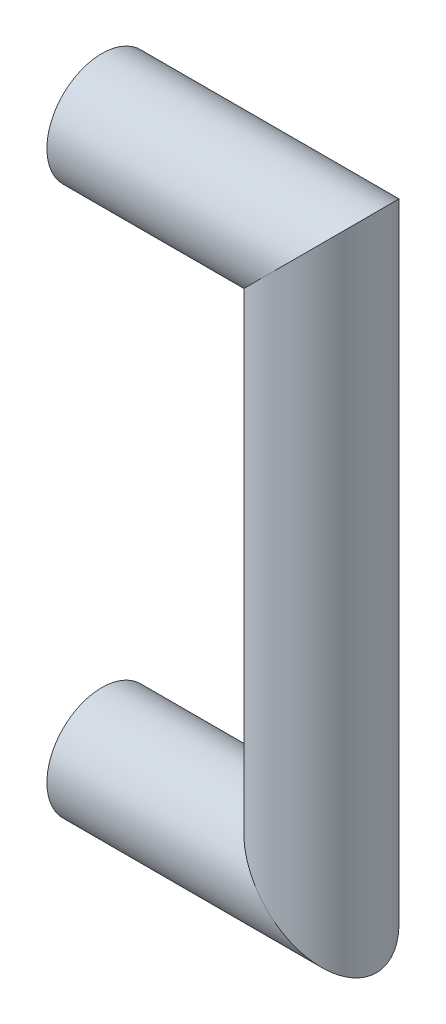
ISO-10303-21;
HEADER;
FILE_DESCRIPTION(('STEP AP214'),'2;1');
FILE_NAME('part.step','',(''),(''),'','','');
FILE_SCHEMA(('AUTOMOTIVE_DESIGN { 1 0 10303 214 1 1 1 1 }'));
ENDSEC;
DATA;
#1=APPLICATION_CONTEXT('core data for automotive mechanical design processes');
#2=APPLICATION_PROTOCOL_DEFINITION('international standard','automotive_design',2000,#1);
#3=PRODUCT_CONTEXT('',#1,'mechanical');
#4=PRODUCT('Part','Part','',(#3));
#5=PRODUCT_RELATED_PRODUCT_CATEGORY('part','',(#4));
#6=PRODUCT_DEFINITION_FORMATION('','',#4);
#7=PRODUCT_DEFINITION_CONTEXT('part definition',#1,'design');
#8=PRODUCT_DEFINITION('design','',#6,#7);
#9=PRODUCT_DEFINITION_SHAPE('','',#8);
#10=(LENGTH_UNIT() NAMED_UNIT(*) SI_UNIT(.MILLI.,.METRE.));
#11=(NAMED_UNIT(*) PLANE_ANGLE_UNIT() SI_UNIT($,.RADIAN.));
#12=(NAMED_UNIT(*) SI_UNIT($,.STERADIAN.) SOLID_ANGLE_UNIT());
#13=UNCERTAINTY_MEASURE_WITH_UNIT(LENGTH_MEASURE(1.E-05),#10,'distance_accuracy_value','');
#14=(GEOMETRIC_REPRESENTATION_CONTEXT(3) GLOBAL_UNCERTAINTY_ASSIGNED_CONTEXT((#13)) GLOBAL_UNIT_ASSIGNED_CONTEXT((#10,
#11,#12)) REPRESENTATION_CONTEXT('',''));
#15=CARTESIAN_POINT('',(0.,0.,0.));
#16=DIRECTION('',(0.,0.,1.));
#17=DIRECTION('',(1.,0.,0.));
#18=AXIS2_PLACEMENT_3D('',#15,#16,#17);
#19=CARTESIAN_POINT('',(0.,-100.,0.));
#20=DIRECTION('',(-1.,0.,0.));
#21=DIRECTION('',(0.,0.,-1.));
#22=AXIS2_PLACEMENT_3D('',#19,#20,#21);
#23=PLANE('',#22);
#24=CARTESIAN_POINT('',(0.,-100.,0.));
#25=DIRECTION('',(-1.,0.,0.));
#26=DIRECTION('',(0.,0.,-1.));
#27=AXIS2_PLACEMENT_3D('',#24,#25,#26);
#28=CIRCLE('',#27,10.);
#29=CARTESIAN_POINT('',(0.,-100.,-10.));
#30=VERTEX_POINT('',#29);
#31=EDGE_CURVE('E40',#30,#30,#28,.T.);
#32=ORIENTED_EDGE('',*,*,#31,.T.);
#33=EDGE_LOOP('',(#32));
#34=FACE_BOUND('',#33,.T.);
#35=ADVANCED_FACE('F37',(#34),#23,.T.);
#36=CARTESIAN_POINT('',(0.,0.,0.));
#37=DIRECTION('',(1.,0.,0.));
#38=DIRECTION('',(0.,0.,-1.));
#39=AXIS2_PLACEMENT_3D('',#36,#37,#38);
#40=PLANE('',#39);
#41=CARTESIAN_POINT('',(0.,0.,0.));
#42=DIRECTION('',(1.,0.,0.));
#43=DIRECTION('',(0.,0.,-1.));
#44=AXIS2_PLACEMENT_3D('',#41,#42,#43);
#45=CIRCLE('',#44,10.);
#46=CARTESIAN_POINT('',(0.,0.,-10.));
#47=VERTEX_POINT('',#46);
#48=EDGE_CURVE('E44',#47,#47,#45,.T.);
#49=ORIENTED_EDGE('',*,*,#48,.F.);
#50=EDGE_LOOP('',(#49));
#51=FACE_BOUND('',#50,.T.);
#52=ADVANCED_FACE('F61',(#51),#40,.F.);
#53=CARTESIAN_POINT('',(62.1,-100.,0.));
#54=DIRECTION('',(-1.,0.,0.));
#55=DIRECTION('',(0.,-1.,0.));
#56=AXIS2_PLACEMENT_3D('',#53,#54,#55);
#57=CYLINDRICAL_SURFACE('',#56,10.);
#58=CARTESIAN_POINT('',(40.,-100.,0.));
#59=DIRECTION('',(-0.707106781186547,-0.707106781186548,0.));
#60=DIRECTION('',(0.707106781186548,-0.707106781186547,0.));
#61=AXIS2_PLACEMENT_3D('',#58,#59,#60);
#62=ELLIPSE('',#61,14.1421356237309,10.);
#63=CARTESIAN_POINT('',(50.,-110.,0.));
#64=VERTEX_POINT('',#63);
#65=EDGE_CURVE('E49',#64,#64,#62,.F.);
#66=ORIENTED_EDGE('',*,*,#65,.F.);
#67=EDGE_LOOP('',(#66));
#68=FACE_BOUND('',#67,.T.);
#69=ORIENTED_EDGE('',*,*,#31,.F.);
#70=EDGE_LOOP('',(#69));
#71=FACE_BOUND('',#70,.T.);
#72=ADVANCED_FACE('F58',(#68,#71),#57,.T.);
#73=CARTESIAN_POINT('',(40.,22.1,0.));
#74=DIRECTION('',(0.,-1.,0.));
#75=DIRECTION('',(1.,0.,0.));
#76=AXIS2_PLACEMENT_3D('',#73,#74,#75);
#77=CYLINDRICAL_SURFACE('',#76,10.);
#78=CARTESIAN_POINT('',(40.,0.,0.));
#79=DIRECTION('',(0.707106781186548,-0.707106781186547,0.));
#80=DIRECTION('',(0.707106781186547,0.707106781186548,0.));
#81=AXIS2_PLACEMENT_3D('',#78,#79,#80);
#82=ELLIPSE('',#81,14.1421356237309,10.);
#83=CARTESIAN_POINT('',(50.,10.,0.));
#84=VERTEX_POINT('',#83);
#85=EDGE_CURVE('E10',#84,#84,#82,.F.);
#86=ORIENTED_EDGE('',*,*,#85,.F.);
#87=EDGE_LOOP('',(#86));
#88=FACE_BOUND('',#87,.T.);
#89=ORIENTED_EDGE('',*,*,#65,.T.);
#90=EDGE_LOOP('',(#89));
#91=FACE_BOUND('',#90,.T.);
#92=ADVANCED_FACE('F60',(#88,#91),#77,.T.);
#93=CARTESIAN_POINT('',(0.,0.,0.));
#94=DIRECTION('',(1.,0.,0.));
#95=DIRECTION('',(0.,0.,-1.));
#96=AXIS2_PLACEMENT_3D('',#93,#94,#95);
#97=CYLINDRICAL_SURFACE('',#96,10.);
#98=ORIENTED_EDGE('',*,*,#48,.T.);
#99=EDGE_LOOP('',(#98));
#100=FACE_BOUND('',#99,.T.);
#101=ORIENTED_EDGE('',*,*,#85,.T.);
#102=EDGE_LOOP('',(#101));
#103=FACE_BOUND('',#102,.T.);
#104=ADVANCED_FACE('F68',(#100,#103),#97,.T.);
#105=CLOSED_SHELL('',(#35,#52,#72,#92,#104));
#106=MANIFOLD_SOLID_BREP('B2',#105);
#107=ADVANCED_BREP_SHAPE_REPRESENTATION('',(#18,#106),#14);
#108=SHAPE_DEFINITION_REPRESENTATION(#9,#107);
ENDSEC;
END-ISO-10303-21;
